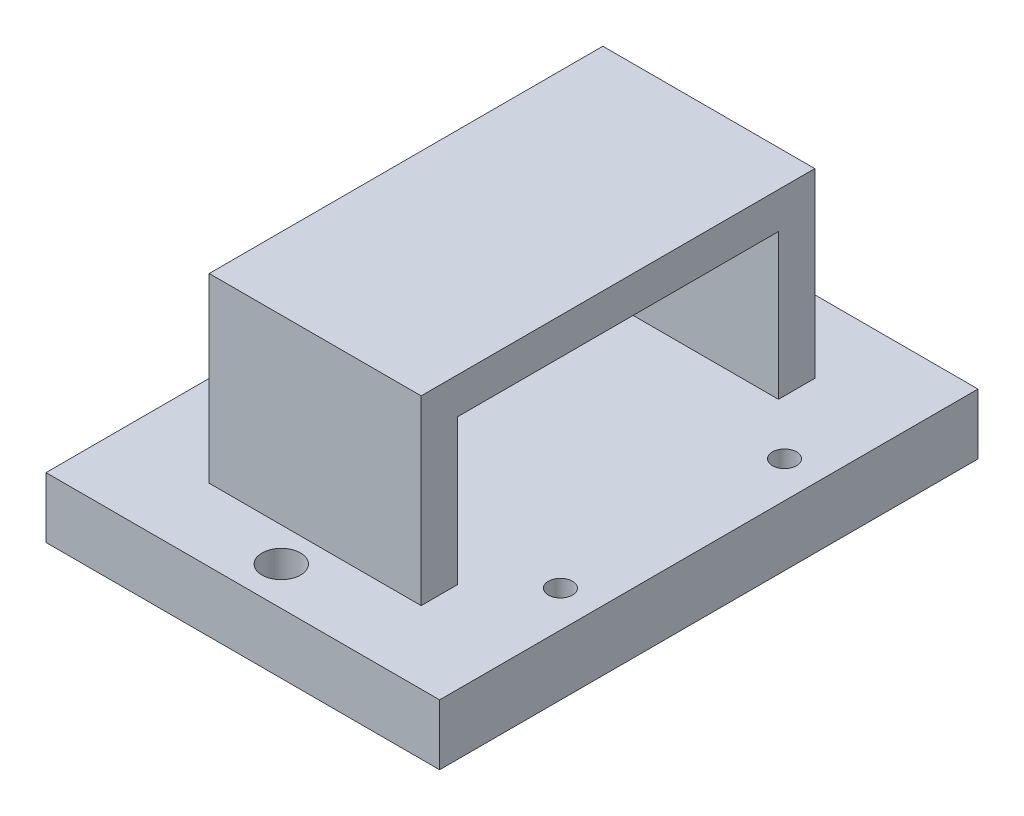
ISO-10303-21;
HEADER;
FILE_DESCRIPTION(('STEP AP214'),'2;1');
FILE_NAME('part.step','',(''),(''),'','','');
FILE_SCHEMA(('AUTOMOTIVE_DESIGN { 1 0 10303 214 1 1 1 1 }'));
ENDSEC;
DATA;
#1=APPLICATION_CONTEXT('core data for automotive mechanical design processes');
#2=APPLICATION_PROTOCOL_DEFINITION('international standard','automotive_design',2000,#1);
#3=PRODUCT_CONTEXT('',#1,'mechanical');
#4=PRODUCT('Part','Part','',(#3));
#5=PRODUCT_RELATED_PRODUCT_CATEGORY('part','',(#4));
#6=PRODUCT_DEFINITION_FORMATION('','',#4);
#7=PRODUCT_DEFINITION_CONTEXT('part definition',#1,'design');
#8=PRODUCT_DEFINITION('design','',#6,#7);
#9=PRODUCT_DEFINITION_SHAPE('','',#8);
#10=(LENGTH_UNIT() NAMED_UNIT(*) SI_UNIT(.MILLI.,.METRE.));
#11=(NAMED_UNIT(*) PLANE_ANGLE_UNIT() SI_UNIT($,.RADIAN.));
#12=(NAMED_UNIT(*) SI_UNIT($,.STERADIAN.) SOLID_ANGLE_UNIT());
#13=UNCERTAINTY_MEASURE_WITH_UNIT(LENGTH_MEASURE(1.E-05),#10,'distance_accuracy_value','');
#14=(GEOMETRIC_REPRESENTATION_CONTEXT(3) GLOBAL_UNCERTAINTY_ASSIGNED_CONTEXT((#13)) GLOBAL_UNIT_ASSIGNED_CONTEXT((#10,
#11,#12)) REPRESENTATION_CONTEXT('',''));
#15=CARTESIAN_POINT('',(0.,0.,0.));
#16=DIRECTION('',(0.,0.,1.));
#17=DIRECTION('',(1.,0.,0.));
#18=AXIS2_PLACEMENT_3D('',#15,#16,#17);
#19=CARTESIAN_POINT('',(-32.5,-10.,-32.5));
#20=DIRECTION('',(-1.,0.,0.));
#21=DIRECTION('',(0.,0.,1.));
#22=AXIS2_PLACEMENT_3D('',#19,#20,#21);
#23=PLANE('',#22);
#24=DIRECTION('',(0.,0.,1.));
#25=VECTOR('',#24,1.);
#26=CARTESIAN_POINT('',(-32.5,0.,-32.5));
#27=LINE('',#26,#25);
#28=CARTESIAN_POINT('',(-32.5,0.,-44.45));
#29=VERTEX_POINT('',#28);
#30=CARTESIAN_POINT('',(-32.5,0.,44.45));
#31=VERTEX_POINT('',#30);
#32=EDGE_CURVE('E157',#29,#31,#27,.T.);
#33=ORIENTED_EDGE('',*,*,#32,.F.);
#34=DIRECTION('',(0.,1.,0.));
#35=VECTOR('',#34,1.);
#36=CARTESIAN_POINT('',(-32.5,-77.4329481781718,-44.45));
#37=LINE('',#36,#35);
#38=CARTESIAN_POINT('',(-32.5,-9.99999999999999,-44.45));
#39=VERTEX_POINT('',#38);
#40=EDGE_CURVE('E189',#39,#29,#37,.T.);
#41=ORIENTED_EDGE('',*,*,#40,.F.);
#42=DIRECTION('',(0.,0.,1.));
#43=VECTOR('',#42,1.);
#44=CARTESIAN_POINT('',(-32.5,-10.,-32.5));
#45=LINE('',#44,#43);
#46=CARTESIAN_POINT('',(-32.5,-9.99999999999999,44.45));
#47=VERTEX_POINT('',#46);
#48=EDGE_CURVE('E43',#39,#47,#45,.T.);
#49=ORIENTED_EDGE('',*,*,#48,.T.);
#50=DIRECTION('',(0.,1.,0.));
#51=VECTOR('',#50,1.);
#52=CARTESIAN_POINT('',(-32.5,-77.4329481781718,44.45));
#53=LINE('',#52,#51);
#54=EDGE_CURVE('E244',#47,#31,#53,.T.);
#55=ORIENTED_EDGE('',*,*,#54,.T.);
#56=EDGE_LOOP('',(#33,#41,#49,#55));
#57=FACE_BOUND('',#56,.T.);
#58=ADVANCED_FACE('F35',(#57),#23,.T.);
#59=CARTESIAN_POINT('',(-32.5,-10.,-32.5));
#60=DIRECTION('',(0.,0.,-1.));
#61=DIRECTION('',(-1.,0.,0.));
#62=AXIS2_PLACEMENT_3D('',#59,#60,#61);
#63=PLANE('',#62);
#64=DIRECTION('',(1.,0.,0.));
#65=VECTOR('',#64,1.);
#66=CARTESIAN_POINT('',(-32.5,0.,-32.5));
#67=LINE('',#66,#65);
#68=CARTESIAN_POINT('',(-17.5,0.,-32.5));
#69=VERTEX_POINT('',#68);
#70=CARTESIAN_POINT('',(17.5,0.,-32.5));
#71=VERTEX_POINT('',#70);
#72=EDGE_CURVE('E60',#69,#71,#67,.T.);
#73=ORIENTED_EDGE('',*,*,#72,.F.);
#74=DIRECTION('',(0.,-1.,0.));
#75=VECTOR('',#74,1.);
#76=CARTESIAN_POINT('',(-17.5,0.,-32.5));
#77=LINE('',#76,#75);
#78=CARTESIAN_POINT('',(-17.5,30.,-32.5));
#79=VERTEX_POINT('',#78);
#80=EDGE_CURVE('E132',#79,#69,#77,.T.);
#81=ORIENTED_EDGE('',*,*,#80,.F.);
#82=DIRECTION('',(-1.,0.,0.));
#83=VECTOR('',#82,1.);
#84=CARTESIAN_POINT('',(17.5,30.,-32.5));
#85=LINE('',#84,#83);
#86=CARTESIAN_POINT('',(17.5,30.,-32.5));
#87=VERTEX_POINT('',#86);
#88=EDGE_CURVE('E93',#87,#79,#85,.T.);
#89=ORIENTED_EDGE('',*,*,#88,.F.);
#90=DIRECTION('',(0.,-1.,0.));
#91=VECTOR('',#90,1.);
#92=CARTESIAN_POINT('',(17.5,0.,-32.5));
#93=LINE('',#92,#91);
#94=EDGE_CURVE('E149',#87,#71,#93,.T.);
#95=ORIENTED_EDGE('',*,*,#94,.T.);
#96=EDGE_LOOP('',(#73,#81,#89,#95));
#97=FACE_BOUND('',#96,.T.);
#98=ADVANCED_FACE('F293',(#97),#63,.T.);
#99=CARTESIAN_POINT('',(32.5,-10.,-32.5));
#100=DIRECTION('',(1.,0.,0.));
#101=DIRECTION('',(0.,0.,-1.));
#102=AXIS2_PLACEMENT_3D('',#99,#100,#101);
#103=PLANE('',#102);
#104=DIRECTION('',(0.,0.,-1.));
#105=VECTOR('',#104,1.);
#106=CARTESIAN_POINT('',(32.5,0.,-32.5));
#107=LINE('',#106,#105);
#108=CARTESIAN_POINT('',(32.5,0.,44.45));
#109=VERTEX_POINT('',#108);
#110=CARTESIAN_POINT('',(32.5,0.,-44.45));
#111=VERTEX_POINT('',#110);
#112=EDGE_CURVE('E38',#109,#111,#107,.T.);
#113=ORIENTED_EDGE('',*,*,#112,.F.);
#114=DIRECTION('',(0.,1.,0.));
#115=VECTOR('',#114,1.);
#116=CARTESIAN_POINT('',(32.5,-77.4329481781718,44.45));
#117=LINE('',#116,#115);
#118=CARTESIAN_POINT('',(32.5,-9.99999999999999,44.45));
#119=VERTEX_POINT('',#118);
#120=EDGE_CURVE('E246',#119,#109,#117,.T.);
#121=ORIENTED_EDGE('',*,*,#120,.F.);
#122=DIRECTION('',(0.,0.,-1.));
#123=VECTOR('',#122,1.);
#124=CARTESIAN_POINT('',(32.5,-10.,-32.5));
#125=LINE('',#124,#123);
#126=CARTESIAN_POINT('',(32.5,-9.99999999999999,-44.45));
#127=VERTEX_POINT('',#126);
#128=EDGE_CURVE('E11',#119,#127,#125,.T.);
#129=ORIENTED_EDGE('',*,*,#128,.T.);
#130=DIRECTION('',(0.,1.,0.));
#131=VECTOR('',#130,1.);
#132=CARTESIAN_POINT('',(32.5,-77.4329481781718,-44.45));
#133=LINE('',#132,#131);
#134=EDGE_CURVE('E183',#127,#111,#133,.T.);
#135=ORIENTED_EDGE('',*,*,#134,.T.);
#136=EDGE_LOOP('',(#113,#121,#129,#135));
#137=FACE_BOUND('',#136,.T.);
#138=ADVANCED_FACE('F184',(#137),#103,.T.);
#139=CARTESIAN_POINT('',(-32.5,-10.,32.5));
#140=DIRECTION('',(0.,0.,1.));
#141=DIRECTION('',(1.,0.,0.));
#142=AXIS2_PLACEMENT_3D('',#139,#140,#141);
#143=PLANE('',#142);
#144=DIRECTION('',(-1.,0.,0.));
#145=VECTOR('',#144,1.);
#146=CARTESIAN_POINT('',(-32.5,0.,32.5));
#147=LINE('',#146,#145);
#148=CARTESIAN_POINT('',(17.5,0.,32.5));
#149=VERTEX_POINT('',#148);
#150=CARTESIAN_POINT('',(-17.5,0.,32.5));
#151=VERTEX_POINT('',#150);
#152=EDGE_CURVE('E197',#149,#151,#147,.T.);
#153=ORIENTED_EDGE('',*,*,#152,.F.);
#154=DIRECTION('',(0.,-1.,0.));
#155=VECTOR('',#154,1.);
#156=CARTESIAN_POINT('',(17.5,0.,32.5));
#157=LINE('',#156,#155);
#158=CARTESIAN_POINT('',(17.5,30.,32.5));
#159=VERTEX_POINT('',#158);
#160=EDGE_CURVE('E210',#159,#149,#157,.T.);
#161=ORIENTED_EDGE('',*,*,#160,.F.);
#162=DIRECTION('',(-1.,0.,0.));
#163=VECTOR('',#162,1.);
#164=CARTESIAN_POINT('',(17.5,30.,32.5));
#165=LINE('',#164,#163);
#166=CARTESIAN_POINT('',(-17.5,30.,32.5));
#167=VERTEX_POINT('',#166);
#168=EDGE_CURVE('E154',#159,#167,#165,.T.);
#169=ORIENTED_EDGE('',*,*,#168,.T.);
#170=DIRECTION('',(0.,-1.,0.));
#171=VECTOR('',#170,1.);
#172=CARTESIAN_POINT('',(-17.5,0.,32.5));
#173=LINE('',#172,#171);
#174=EDGE_CURVE('E138',#167,#151,#173,.T.);
#175=ORIENTED_EDGE('',*,*,#174,.T.);
#176=EDGE_LOOP('',(#153,#161,#169,#175));
#177=FACE_BOUND('',#176,.T.);
#178=ADVANCED_FACE('F268',(#177),#143,.T.);
#179=CARTESIAN_POINT('',(0.,-10.,0.));
#180=DIRECTION('',(0.,1.,0.));
#181=DIRECTION('',(0.,0.,1.));
#182=AXIS2_PLACEMENT_3D('',#179,#180,#181);
#183=PLANE('',#182);
#184=CARTESIAN_POINT('',(-26.5,-9.99999999999999,18.5));
#185=DIRECTION('',(0.,1.,0.));
#186=DIRECTION('',(0.,0.,1.));
#187=AXIS2_PLACEMENT_3D('',#184,#185,#186);
#188=CIRCLE('',#187,1.99);
#189=CARTESIAN_POINT('',(-26.5,-9.99999999999999,20.49));
#190=VERTEX_POINT('',#189);
#191=EDGE_CURVE('E429',#190,#190,#188,.T.);
#192=ORIENTED_EDGE('',*,*,#191,.T.);
#193=EDGE_LOOP('',(#192));
#194=FACE_BOUND('',#193,.T.);
#195=CARTESIAN_POINT('',(26.5,-9.99999999999999,18.5));
#196=DIRECTION('',(0.,1.,0.));
#197=DIRECTION('',(0.,0.,1.));
#198=AXIS2_PLACEMENT_3D('',#195,#196,#197);
#199=CIRCLE('',#198,1.99);
#200=CARTESIAN_POINT('',(26.5,-9.99999999999999,20.49));
#201=VERTEX_POINT('',#200);
#202=EDGE_CURVE('E449',#201,#201,#199,.T.);
#203=ORIENTED_EDGE('',*,*,#202,.T.);
#204=EDGE_LOOP('',(#203));
#205=FACE_BOUND('',#204,.T.);
#206=CARTESIAN_POINT('',(26.5,-9.99999999999999,-18.5));
#207=DIRECTION('',(0.,1.,0.));
#208=DIRECTION('',(0.,0.,1.));
#209=AXIS2_PLACEMENT_3D('',#206,#207,#208);
#210=CIRCLE('',#209,1.99);
#211=CARTESIAN_POINT('',(26.5,-9.99999999999999,-16.51));
#212=VERTEX_POINT('',#211);
#213=EDGE_CURVE('E440',#212,#212,#210,.T.);
#214=ORIENTED_EDGE('',*,*,#213,.T.);
#215=EDGE_LOOP('',(#214));
#216=FACE_BOUND('',#215,.T.);
#217=CARTESIAN_POINT('',(-26.5,-9.99999999999999,-18.5));
#218=DIRECTION('',(0.,1.,0.));
#219=DIRECTION('',(0.,0.,1.));
#220=AXIS2_PLACEMENT_3D('',#217,#218,#219);
#221=CIRCLE('',#220,1.99);
#222=CARTESIAN_POINT('',(-26.5,-9.99999999999999,-16.51));
#223=VERTEX_POINT('',#222);
#224=EDGE_CURVE('E256',#223,#223,#221,.T.);
#225=ORIENTED_EDGE('',*,*,#224,.T.);
#226=EDGE_LOOP('',(#225));
#227=FACE_BOUND('',#226,.T.);
#228=DIRECTION('',(-1.,0.,0.));
#229=VECTOR('',#228,1.);
#230=CARTESIAN_POINT('',(0.,-9.99999999999999,44.45));
#231=LINE('',#230,#229);
#232=EDGE_CURVE('E241',#119,#47,#231,.T.);
#233=ORIENTED_EDGE('',*,*,#232,.T.);
#234=ORIENTED_EDGE('',*,*,#48,.F.);
#235=DIRECTION('',(-1.,0.,0.));
#236=VECTOR('',#235,1.);
#237=CARTESIAN_POINT('',(0.,-9.99999999999999,-44.45));
#238=LINE('',#237,#236);
#239=EDGE_CURVE('E201',#127,#39,#238,.T.);
#240=ORIENTED_EDGE('',*,*,#239,.F.);
#241=ORIENTED_EDGE('',*,*,#128,.F.);
#242=EDGE_LOOP('',(#233,#234,#240,#241));
#243=FACE_BOUND('',#242,.T.);
#244=CARTESIAN_POINT('',(0.,-9.99999999999999,-38.1));
#245=DIRECTION('',(0.,1.,0.));
#246=DIRECTION('',(0.,0.,1.));
#247=AXIS2_PLACEMENT_3D('',#244,#245,#246);
#248=CIRCLE('',#247,3.175);
#249=CARTESIAN_POINT('',(0.,-9.99999999999999,-34.925));
#250=VERTEX_POINT('',#249);
#251=EDGE_CURVE('E204',#250,#250,#248,.F.);
#252=ORIENTED_EDGE('',*,*,#251,.F.);
#253=EDGE_LOOP('',(#252));
#254=FACE_BOUND('',#253,.T.);
#255=CARTESIAN_POINT('',(0.,-9.99999999999999,38.1));
#256=DIRECTION('',(0.,1.,0.));
#257=DIRECTION('',(0.,0.,1.));
#258=AXIS2_PLACEMENT_3D('',#255,#256,#257);
#259=CIRCLE('',#258,3.175);
#260=CARTESIAN_POINT('',(0.,-9.99999999999999,41.275));
#261=VERTEX_POINT('',#260);
#262=EDGE_CURVE('E252',#261,#261,#259,.T.);
#263=ORIENTED_EDGE('',*,*,#262,.T.);
#264=EDGE_LOOP('',(#263));
#265=FACE_BOUND('',#264,.T.);
#266=ADVANCED_FACE('F238',(#194,#205,#216,#227,#243,#254,#265),#183,.F.);
#267=CARTESIAN_POINT('',(0.,0.,0.));
#268=DIRECTION('',(0.,1.,0.));
#269=DIRECTION('',(0.,0.,1.));
#270=AXIS2_PLACEMENT_3D('',#267,#268,#269);
#271=PLANE('',#270);
#272=CARTESIAN_POINT('',(-26.5,0.,18.5));
#273=DIRECTION('',(0.,1.,0.));
#274=DIRECTION('',(0.,0.,1.));
#275=AXIS2_PLACEMENT_3D('',#272,#273,#274);
#276=CIRCLE('',#275,1.99);
#277=CARTESIAN_POINT('',(-26.5,0.,20.49));
#278=VERTEX_POINT('',#277);
#279=EDGE_CURVE('E431',#278,#278,#276,.T.);
#280=ORIENTED_EDGE('',*,*,#279,.F.);
#281=EDGE_LOOP('',(#280));
#282=FACE_BOUND('',#281,.T.);
#283=CARTESIAN_POINT('',(26.5,0.,18.5));
#284=DIRECTION('',(0.,1.,0.));
#285=DIRECTION('',(0.,0.,1.));
#286=AXIS2_PLACEMENT_3D('',#283,#284,#285);
#287=CIRCLE('',#286,1.99);
#288=CARTESIAN_POINT('',(26.5,0.,20.49));
#289=VERTEX_POINT('',#288);
#290=EDGE_CURVE('E433',#289,#289,#287,.T.);
#291=ORIENTED_EDGE('',*,*,#290,.F.);
#292=EDGE_LOOP('',(#291));
#293=FACE_BOUND('',#292,.T.);
#294=CARTESIAN_POINT('',(26.5,0.,-18.5));
#295=DIRECTION('',(0.,1.,0.));
#296=DIRECTION('',(0.,0.,1.));
#297=AXIS2_PLACEMENT_3D('',#294,#295,#296);
#298=CIRCLE('',#297,1.99);
#299=CARTESIAN_POINT('',(26.5,0.,-16.51));
#300=VERTEX_POINT('',#299);
#301=EDGE_CURVE('E444',#300,#300,#298,.T.);
#302=ORIENTED_EDGE('',*,*,#301,.F.);
#303=EDGE_LOOP('',(#302));
#304=FACE_BOUND('',#303,.T.);
#305=CARTESIAN_POINT('',(-26.5,0.,-18.5));
#306=DIRECTION('',(0.,1.,0.));
#307=DIRECTION('',(0.,0.,1.));
#308=AXIS2_PLACEMENT_3D('',#305,#306,#307);
#309=CIRCLE('',#308,1.99);
#310=CARTESIAN_POINT('',(-26.5,0.,-16.51));
#311=VERTEX_POINT('',#310);
#312=EDGE_CURVE('E438',#311,#311,#309,.T.);
#313=ORIENTED_EDGE('',*,*,#312,.F.);
#314=EDGE_LOOP('',(#313));
#315=FACE_BOUND('',#314,.T.);
#316=ORIENTED_EDGE('',*,*,#152,.T.);
#317=DIRECTION('',(0.,0.,-1.));
#318=VECTOR('',#317,1.);
#319=CARTESIAN_POINT('',(-17.5,0.,0.));
#320=LINE('',#319,#318);
#321=CARTESIAN_POINT('',(-17.5,0.,26.5));
#322=VERTEX_POINT('',#321);
#323=EDGE_CURVE('E141',#151,#322,#320,.T.);
#324=ORIENTED_EDGE('',*,*,#323,.T.);
#325=DIRECTION('',(-1.,0.,0.));
#326=VECTOR('',#325,1.);
#327=CARTESIAN_POINT('',(17.5,0.,26.5));
#328=LINE('',#327,#326);
#329=CARTESIAN_POINT('',(17.5,0.,26.5));
#330=VERTEX_POINT('',#329);
#331=EDGE_CURVE('E152',#330,#322,#328,.T.);
#332=ORIENTED_EDGE('',*,*,#331,.F.);
#333=DIRECTION('',(0.,0.,-1.));
#334=VECTOR('',#333,1.);
#335=CARTESIAN_POINT('',(17.5,0.,0.));
#336=LINE('',#335,#334);
#337=EDGE_CURVE('E213',#149,#330,#336,.T.);
#338=ORIENTED_EDGE('',*,*,#337,.F.);
#339=EDGE_LOOP('',(#316,#324,#332,#338));
#340=FACE_BOUND('',#339,.T.);
#341=DIRECTION('',(1.,0.,0.));
#342=VECTOR('',#341,1.);
#343=CARTESIAN_POINT('',(0.,0.,-44.45));
#344=LINE('',#343,#342);
#345=EDGE_CURVE('E173',#29,#111,#344,.T.);
#346=ORIENTED_EDGE('',*,*,#345,.F.);
#347=ORIENTED_EDGE('',*,*,#32,.T.);
#348=DIRECTION('',(1.,0.,0.));
#349=VECTOR('',#348,1.);
#350=CARTESIAN_POINT('',(0.,0.,44.45));
#351=LINE('',#350,#349);
#352=EDGE_CURVE('E176',#31,#109,#351,.T.);
#353=ORIENTED_EDGE('',*,*,#352,.T.);
#354=ORIENTED_EDGE('',*,*,#112,.T.);
#355=EDGE_LOOP('',(#346,#347,#353,#354));
#356=FACE_BOUND('',#355,.T.);
#357=DIRECTION('',(0.,0.,1.));
#358=VECTOR('',#357,1.);
#359=CARTESIAN_POINT('',(-17.5,0.,0.));
#360=LINE('',#359,#358);
#361=CARTESIAN_POINT('',(-17.5,0.,-26.5));
#362=VERTEX_POINT('',#361);
#363=EDGE_CURVE('E147',#69,#362,#360,.T.);
#364=ORIENTED_EDGE('',*,*,#363,.F.);
#365=ORIENTED_EDGE('',*,*,#72,.T.);
#366=DIRECTION('',(0.,0.,1.));
#367=VECTOR('',#366,1.);
#368=CARTESIAN_POINT('',(17.5,0.,0.));
#369=LINE('',#368,#367);
#370=CARTESIAN_POINT('',(17.5,0.,-26.5));
#371=VERTEX_POINT('',#370);
#372=EDGE_CURVE('E127',#71,#371,#369,.T.);
#373=ORIENTED_EDGE('',*,*,#372,.T.);
#374=DIRECTION('',(-1.,0.,0.));
#375=VECTOR('',#374,1.);
#376=CARTESIAN_POINT('',(17.5,0.,-26.5));
#377=LINE('',#376,#375);
#378=EDGE_CURVE('E123',#371,#362,#377,.T.);
#379=ORIENTED_EDGE('',*,*,#378,.T.);
#380=EDGE_LOOP('',(#364,#365,#373,#379));
#381=FACE_BOUND('',#380,.T.);
#382=CARTESIAN_POINT('',(0.,0.,-38.1));
#383=DIRECTION('',(0.,1.,0.));
#384=DIRECTION('',(0.,0.,1.));
#385=AXIS2_PLACEMENT_3D('',#382,#383,#384);
#386=CIRCLE('',#385,3.175);
#387=CARTESIAN_POINT('',(0.,0.,-34.925));
#388=VERTEX_POINT('',#387);
#389=EDGE_CURVE('E194',#388,#388,#386,.T.);
#390=ORIENTED_EDGE('',*,*,#389,.F.);
#391=EDGE_LOOP('',(#390));
#392=FACE_BOUND('',#391,.T.);
#393=CARTESIAN_POINT('',(0.,0.,38.1));
#394=DIRECTION('',(0.,1.,0.));
#395=DIRECTION('',(0.,0.,1.));
#396=AXIS2_PLACEMENT_3D('',#393,#394,#395);
#397=CIRCLE('',#396,3.175);
#398=CARTESIAN_POINT('',(0.,0.,41.275));
#399=VERTEX_POINT('',#398);
#400=EDGE_CURVE('E249',#399,#399,#397,.F.);
#401=ORIENTED_EDGE('',*,*,#400,.T.);
#402=EDGE_LOOP('',(#401));
#403=FACE_BOUND('',#402,.T.);
#404=ADVANCED_FACE('F170',(#282,#293,#304,#315,#340,#356,#381,#392,#403),#271,.T.);
#405=CARTESIAN_POINT('',(17.5,30.,0.));
#406=DIRECTION('',(0.,1.,0.));
#407=DIRECTION('',(0.,0.,1.));
#408=AXIS2_PLACEMENT_3D('',#405,#406,#407);
#409=PLANE('',#408);
#410=DIRECTION('',(0.,0.,-1.));
#411=VECTOR('',#410,1.);
#412=CARTESIAN_POINT('',(-17.5,30.,0.));
#413=LINE('',#412,#411);
#414=EDGE_CURVE('E135',#167,#79,#413,.T.);
#415=ORIENTED_EDGE('',*,*,#414,.F.);
#416=ORIENTED_EDGE('',*,*,#168,.F.);
#417=DIRECTION('',(0.,0.,-1.));
#418=VECTOR('',#417,1.);
#419=CARTESIAN_POINT('',(17.5,30.,0.));
#420=LINE('',#419,#418);
#421=EDGE_CURVE('E207',#159,#87,#420,.T.);
#422=ORIENTED_EDGE('',*,*,#421,.T.);
#423=ORIENTED_EDGE('',*,*,#88,.T.);
#424=EDGE_LOOP('',(#415,#416,#422,#423));
#425=FACE_BOUND('',#424,.T.);
#426=ADVANCED_FACE('F281',(#425),#409,.T.);
#427=CARTESIAN_POINT('',(17.5,0.,26.5));
#428=DIRECTION('',(0.,0.,-1.));
#429=DIRECTION('',(-1.,0.,0.));
#430=AXIS2_PLACEMENT_3D('',#427,#428,#429);
#431=PLANE('',#430);
#432=DIRECTION('',(0.,-1.,0.));
#433=VECTOR('',#432,1.);
#434=CARTESIAN_POINT('',(-17.5,0.,26.5));
#435=LINE('',#434,#433);
#436=CARTESIAN_POINT('',(-17.5,24.,26.5));
#437=VERTEX_POINT('',#436);
#438=EDGE_CURVE('E51',#437,#322,#435,.T.);
#439=ORIENTED_EDGE('',*,*,#438,.F.);
#440=DIRECTION('',(-1.,0.,0.));
#441=VECTOR('',#440,1.);
#442=CARTESIAN_POINT('',(17.5,24.,26.5));
#443=LINE('',#442,#441);
#444=CARTESIAN_POINT('',(17.5,24.,26.5));
#445=VERTEX_POINT('',#444);
#446=EDGE_CURVE('E122',#445,#437,#443,.T.);
#447=ORIENTED_EDGE('',*,*,#446,.F.);
#448=DIRECTION('',(0.,-1.,0.));
#449=VECTOR('',#448,1.);
#450=CARTESIAN_POINT('',(17.5,0.,26.5));
#451=LINE('',#450,#449);
#452=EDGE_CURVE('E116',#445,#330,#451,.T.);
#453=ORIENTED_EDGE('',*,*,#452,.T.);
#454=ORIENTED_EDGE('',*,*,#331,.T.);
#455=EDGE_LOOP('',(#439,#447,#453,#454));
#456=FACE_BOUND('',#455,.T.);
#457=ADVANCED_FACE('F216',(#456),#431,.T.);
#458=CARTESIAN_POINT('',(17.5,24.,0.));
#459=DIRECTION('',(0.,1.,0.));
#460=DIRECTION('',(0.,0.,1.));
#461=AXIS2_PLACEMENT_3D('',#458,#459,#460);
#462=PLANE('',#461);
#463=DIRECTION('',(0.,0.,-1.));
#464=VECTOR('',#463,1.);
#465=CARTESIAN_POINT('',(-17.5,24.,0.));
#466=LINE('',#465,#464);
#467=CARTESIAN_POINT('',(-17.5,24.,-26.5));
#468=VERTEX_POINT('',#467);
#469=EDGE_CURVE('E121',#437,#468,#466,.T.);
#470=ORIENTED_EDGE('',*,*,#469,.T.);
#471=DIRECTION('',(-1.,0.,0.));
#472=VECTOR('',#471,1.);
#473=CARTESIAN_POINT('',(17.5,24.,-26.5));
#474=LINE('',#473,#472);
#475=CARTESIAN_POINT('',(17.5,24.,-26.5));
#476=VERTEX_POINT('',#475);
#477=EDGE_CURVE('E119',#476,#468,#474,.T.);
#478=ORIENTED_EDGE('',*,*,#477,.F.);
#479=DIRECTION('',(0.,0.,-1.));
#480=VECTOR('',#479,1.);
#481=CARTESIAN_POINT('',(17.5,24.,0.));
#482=LINE('',#481,#480);
#483=EDGE_CURVE('E109',#445,#476,#482,.T.);
#484=ORIENTED_EDGE('',*,*,#483,.F.);
#485=ORIENTED_EDGE('',*,*,#446,.T.);
#486=EDGE_LOOP('',(#470,#478,#484,#485));
#487=FACE_BOUND('',#486,.T.);
#488=ADVANCED_FACE('F120',(#487),#462,.F.);
#489=CARTESIAN_POINT('',(17.5,0.,-26.5));
#490=DIRECTION('',(0.,0.,-1.));
#491=DIRECTION('',(-1.,0.,0.));
#492=AXIS2_PLACEMENT_3D('',#489,#490,#491);
#493=PLANE('',#492);
#494=DIRECTION('',(0.,-1.,0.));
#495=VECTOR('',#494,1.);
#496=CARTESIAN_POINT('',(-17.5,0.,-26.5));
#497=LINE('',#496,#495);
#498=EDGE_CURVE('E86',#468,#362,#497,.T.);
#499=ORIENTED_EDGE('',*,*,#498,.T.);
#500=ORIENTED_EDGE('',*,*,#378,.F.);
#501=DIRECTION('',(0.,-1.,0.));
#502=VECTOR('',#501,1.);
#503=CARTESIAN_POINT('',(17.5,0.,-26.5));
#504=LINE('',#503,#502);
#505=EDGE_CURVE('E114',#476,#371,#504,.T.);
#506=ORIENTED_EDGE('',*,*,#505,.F.);
#507=ORIENTED_EDGE('',*,*,#477,.T.);
#508=EDGE_LOOP('',(#499,#500,#506,#507));
#509=FACE_BOUND('',#508,.T.);
#510=ADVANCED_FACE('F125',(#509),#493,.F.);
#511=CARTESIAN_POINT('',(17.5,0.,0.));
#512=DIRECTION('',(1.,0.,0.));
#513=DIRECTION('',(0.,0.,-1.));
#514=AXIS2_PLACEMENT_3D('',#511,#512,#513);
#515=PLANE('',#514);
#516=ORIENTED_EDGE('',*,*,#94,.F.);
#517=ORIENTED_EDGE('',*,*,#421,.F.);
#518=ORIENTED_EDGE('',*,*,#160,.T.);
#519=ORIENTED_EDGE('',*,*,#337,.T.);
#520=ORIENTED_EDGE('',*,*,#452,.F.);
#521=ORIENTED_EDGE('',*,*,#483,.T.);
#522=ORIENTED_EDGE('',*,*,#505,.T.);
#523=ORIENTED_EDGE('',*,*,#372,.F.);
#524=EDGE_LOOP('',(#516,#517,#518,#519,#520,#521,#522,#523));
#525=FACE_BOUND('',#524,.T.);
#526=ADVANCED_FACE('F111',(#525),#515,.T.);
#527=CARTESIAN_POINT('',(-17.5,0.,0.));
#528=DIRECTION('',(1.,0.,0.));
#529=DIRECTION('',(0.,0.,-1.));
#530=AXIS2_PLACEMENT_3D('',#527,#528,#529);
#531=PLANE('',#530);
#532=ORIENTED_EDGE('',*,*,#80,.T.);
#533=ORIENTED_EDGE('',*,*,#363,.T.);
#534=ORIENTED_EDGE('',*,*,#498,.F.);
#535=ORIENTED_EDGE('',*,*,#469,.F.);
#536=ORIENTED_EDGE('',*,*,#438,.T.);
#537=ORIENTED_EDGE('',*,*,#323,.F.);
#538=ORIENTED_EDGE('',*,*,#174,.F.);
#539=ORIENTED_EDGE('',*,*,#414,.T.);
#540=EDGE_LOOP('',(#532,#533,#534,#535,#536,#537,#538,#539));
#541=FACE_BOUND('',#540,.T.);
#542=ADVANCED_FACE('F224',(#541),#531,.F.);
#543=CARTESIAN_POINT('',(0.,-77.4329481781718,-38.1));
#544=DIRECTION('',(0.,1.,0.));
#545=DIRECTION('',(0.,0.,1.));
#546=AXIS2_PLACEMENT_3D('',#543,#544,#545);
#547=CYLINDRICAL_SURFACE('',#546,3.175);
#548=ORIENTED_EDGE('',*,*,#251,.T.);
#549=EDGE_LOOP('',(#548));
#550=FACE_BOUND('',#549,.T.);
#551=ORIENTED_EDGE('',*,*,#389,.T.);
#552=EDGE_LOOP('',(#551));
#553=FACE_BOUND('',#552,.T.);
#554=ADVANCED_FACE('F264',(#550,#553),#547,.F.);
#555=CARTESIAN_POINT('',(0.,-77.4329481781718,-44.45));
#556=DIRECTION('',(0.,0.,1.));
#557=DIRECTION('',(1.,0.,0.));
#558=AXIS2_PLACEMENT_3D('',#555,#556,#557);
#559=PLANE('',#558);
#560=ORIENTED_EDGE('',*,*,#134,.F.);
#561=ORIENTED_EDGE('',*,*,#239,.T.);
#562=ORIENTED_EDGE('',*,*,#40,.T.);
#563=ORIENTED_EDGE('',*,*,#345,.T.);
#564=EDGE_LOOP('',(#560,#561,#562,#563));
#565=FACE_BOUND('',#564,.T.);
#566=ADVANCED_FACE('F192',(#565),#559,.F.);
#567=CARTESIAN_POINT('',(0.,-77.4329481781718,44.45));
#568=DIRECTION('',(0.,0.,1.));
#569=DIRECTION('',(1.,0.,0.));
#570=AXIS2_PLACEMENT_3D('',#567,#568,#569);
#571=PLANE('',#570);
#572=ORIENTED_EDGE('',*,*,#232,.F.);
#573=ORIENTED_EDGE('',*,*,#120,.T.);
#574=ORIENTED_EDGE('',*,*,#352,.F.);
#575=ORIENTED_EDGE('',*,*,#54,.F.);
#576=EDGE_LOOP('',(#572,#573,#574,#575));
#577=FACE_BOUND('',#576,.T.);
#578=ADVANCED_FACE('F248',(#577),#571,.T.);
#579=CARTESIAN_POINT('',(0.,-77.4329481781718,38.1));
#580=DIRECTION('',(0.,1.,0.));
#581=DIRECTION('',(0.,0.,1.));
#582=AXIS2_PLACEMENT_3D('',#579,#580,#581);
#583=CYLINDRICAL_SURFACE('',#582,3.175);
#584=ORIENTED_EDGE('',*,*,#262,.F.);
#585=EDGE_LOOP('',(#584));
#586=FACE_BOUND('',#585,.T.);
#587=ORIENTED_EDGE('',*,*,#400,.F.);
#588=EDGE_LOOP('',(#587));
#589=FACE_BOUND('',#588,.T.);
#590=ADVANCED_FACE('F273',(#586,#589),#583,.F.);
#591=CARTESIAN_POINT('',(-26.5,-9.99999999999999,-18.5));
#592=DIRECTION('',(0.,1.,0.));
#593=DIRECTION('',(0.,0.,1.));
#594=AXIS2_PLACEMENT_3D('',#591,#592,#593);
#595=CYLINDRICAL_SURFACE('',#594,1.99);
#596=ORIENTED_EDGE('',*,*,#224,.F.);
#597=EDGE_LOOP('',(#596));
#598=FACE_BOUND('',#597,.T.);
#599=ORIENTED_EDGE('',*,*,#312,.T.);
#600=EDGE_LOOP('',(#599));
#601=FACE_BOUND('',#600,.T.);
#602=ADVANCED_FACE('F276',(#598,#601),#595,.F.);
#603=CARTESIAN_POINT('',(26.5,-9.99999999999999,-18.5));
#604=DIRECTION('',(0.,1.,0.));
#605=DIRECTION('',(0.,0.,1.));
#606=AXIS2_PLACEMENT_3D('',#603,#604,#605);
#607=CYLINDRICAL_SURFACE('',#606,1.99);
#608=ORIENTED_EDGE('',*,*,#213,.F.);
#609=EDGE_LOOP('',(#608));
#610=FACE_BOUND('',#609,.T.);
#611=ORIENTED_EDGE('',*,*,#301,.T.);
#612=EDGE_LOOP('',(#611));
#613=FACE_BOUND('',#612,.T.);
#614=ADVANCED_FACE('F392',(#610,#613),#607,.F.);
#615=CARTESIAN_POINT('',(26.5,-9.99999999999999,18.5));
#616=DIRECTION('',(0.,1.,0.));
#617=DIRECTION('',(0.,0.,1.));
#618=AXIS2_PLACEMENT_3D('',#615,#616,#617);
#619=CYLINDRICAL_SURFACE('',#618,1.99);
#620=ORIENTED_EDGE('',*,*,#202,.F.);
#621=EDGE_LOOP('',(#620));
#622=FACE_BOUND('',#621,.T.);
#623=ORIENTED_EDGE('',*,*,#290,.T.);
#624=EDGE_LOOP('',(#623));
#625=FACE_BOUND('',#624,.T.);
#626=ADVANCED_FACE('F402',(#622,#625),#619,.F.);
#627=CARTESIAN_POINT('',(-26.5,-9.99999999999999,18.5));
#628=DIRECTION('',(0.,1.,0.));
#629=DIRECTION('',(0.,0.,1.));
#630=AXIS2_PLACEMENT_3D('',#627,#628,#629);
#631=CYLINDRICAL_SURFACE('',#630,1.99);
#632=ORIENTED_EDGE('',*,*,#191,.F.);
#633=EDGE_LOOP('',(#632));
#634=FACE_BOUND('',#633,.T.);
#635=ORIENTED_EDGE('',*,*,#279,.T.);
#636=EDGE_LOOP('',(#635));
#637=FACE_BOUND('',#636,.T.);
#638=ADVANCED_FACE('F412',(#634,#637),#631,.F.);
#639=CLOSED_SHELL('',(#58,#98,#138,#178,#266,#404,#426,#457,#488,#510,#526,#542,#554,#566,#578,
#590,#602,#614,#626,#638));
#640=MANIFOLD_SOLID_BREP('B2',#639);
#641=ADVANCED_BREP_SHAPE_REPRESENTATION('',(#18,#640),#14);
#642=SHAPE_DEFINITION_REPRESENTATION(#9,#641);
ENDSEC;
END-ISO-10303-21;
